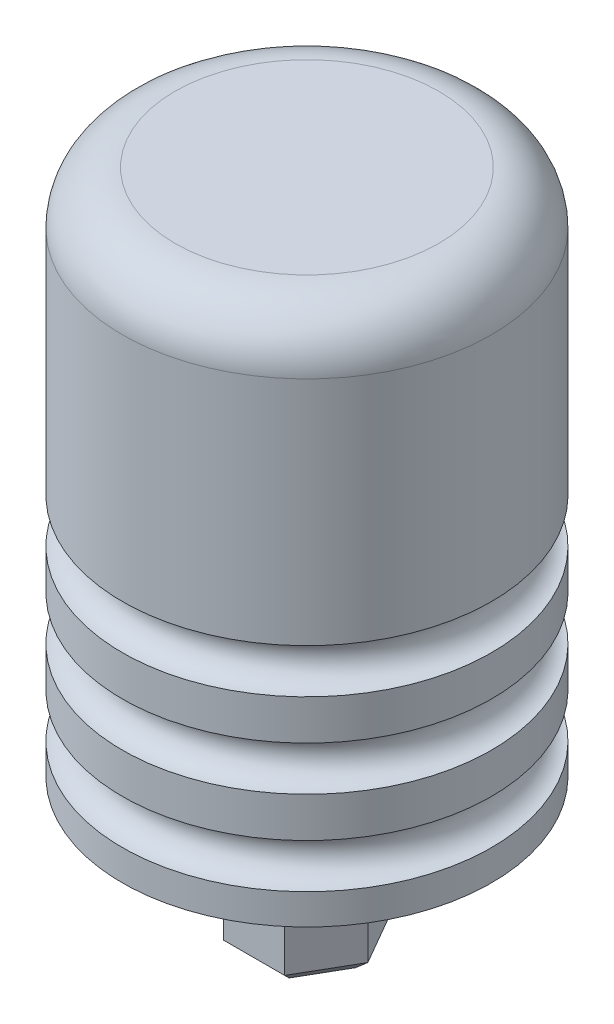
ISO-10303-21;
HEADER;
FILE_DESCRIPTION(('STEP AP214'),'2;1');
FILE_NAME('part.step','',(''),(''),'','','');
FILE_SCHEMA(('AUTOMOTIVE_DESIGN { 1 0 10303 214 1 1 1 1 }'));
ENDSEC;
DATA;
#1=APPLICATION_CONTEXT('core data for automotive mechanical design processes');
#2=APPLICATION_PROTOCOL_DEFINITION('international standard','automotive_design',2000,#1);
#3=PRODUCT_CONTEXT('',#1,'mechanical');
#4=PRODUCT('Part','Part','',(#3));
#5=PRODUCT_RELATED_PRODUCT_CATEGORY('part','',(#4));
#6=PRODUCT_DEFINITION_FORMATION('','',#4);
#7=PRODUCT_DEFINITION_CONTEXT('part definition',#1,'design');
#8=PRODUCT_DEFINITION('design','',#6,#7);
#9=PRODUCT_DEFINITION_SHAPE('','',#8);
#10=(LENGTH_UNIT() NAMED_UNIT(*) SI_UNIT(.MILLI.,.METRE.));
#11=(NAMED_UNIT(*) PLANE_ANGLE_UNIT() SI_UNIT($,.RADIAN.));
#12=(NAMED_UNIT(*) SI_UNIT($,.STERADIAN.) SOLID_ANGLE_UNIT());
#13=UNCERTAINTY_MEASURE_WITH_UNIT(LENGTH_MEASURE(1.E-05),#10,'distance_accuracy_value','');
#14=(GEOMETRIC_REPRESENTATION_CONTEXT(3) GLOBAL_UNCERTAINTY_ASSIGNED_CONTEXT((#13)) GLOBAL_UNIT_ASSIGNED_CONTEXT((#10,
#11,#12)) REPRESENTATION_CONTEXT('',''));
#15=CARTESIAN_POINT('',(0.,0.,0.));
#16=DIRECTION('',(0.,0.,1.));
#17=DIRECTION('',(1.,0.,0.));
#18=AXIS2_PLACEMENT_3D('',#15,#16,#17);
#19=CARTESIAN_POINT('',(22.225,0.,0.));
#20=DIRECTION('',(0.,-1.,0.));
#21=DIRECTION('',(0.,0.,-1.));
#22=AXIS2_PLACEMENT_3D('',#19,#20,#21);
#23=PLANE('',#22);
#24=DIRECTION('',(0.5,0.,0.866025403784439));
#25=VECTOR('',#24,1.);
#26=CARTESIAN_POINT('',(14.3550681024499,0.,4.54370729955457));
#27=LINE('',#26,#25);
#28=CARTESIAN_POINT('',(11.7317574699332,0.,0.));
#29=VERTEX_POINT('',#28);
#30=CARTESIAN_POINT('',(5.8658787349666,0.,-10.16));
#31=VERTEX_POINT('',#30);
#32=EDGE_CURVE('E172',#29,#31,#27,.F.);
#33=ORIENTED_EDGE('',*,*,#32,.T.);
#34=DIRECTION('',(1.,0.,0.));
#35=VECTOR('',#34,1.);
#36=CARTESIAN_POINT('',(22.225,0.,-10.16));
#37=LINE('',#36,#35);
#38=CARTESIAN_POINT('',(-5.86587873496659,0.,-10.16));
#39=VERTEX_POINT('',#38);
#40=EDGE_CURVE('E154',#31,#39,#37,.F.);
#41=ORIENTED_EDGE('',*,*,#40,.T.);
#42=DIRECTION('',(0.5,0.,-0.866025403784439));
#43=VECTOR('',#42,1.);
#44=CARTESIAN_POINT('',(-3.24256810244988,0.,-14.7037072995546));
#45=LINE('',#44,#43);
#46=CARTESIAN_POINT('',(-11.7317574699332,0.,0.));
#47=VERTEX_POINT('',#46);
#48=EDGE_CURVE('E192',#39,#47,#45,.F.);
#49=ORIENTED_EDGE('',*,*,#48,.T.);
#50=DIRECTION('',(-0.5,0.,-0.866025403784439));
#51=VECTOR('',#50,1.);
#52=CARTESIAN_POINT('',(-3.24256810244991,0.,14.7037072995546));
#53=LINE('',#52,#51);
#54=CARTESIAN_POINT('',(-5.86587873496659,0.,10.16));
#55=VERTEX_POINT('',#54);
#56=EDGE_CURVE('E189',#47,#55,#53,.F.);
#57=ORIENTED_EDGE('',*,*,#56,.T.);
#58=DIRECTION('',(-1.,0.,0.));
#59=VECTOR('',#58,1.);
#60=CARTESIAN_POINT('',(22.225,0.,10.16));
#61=LINE('',#60,#59);
#62=CARTESIAN_POINT('',(5.8658787349666,0.,10.16));
#63=VERTEX_POINT('',#62);
#64=EDGE_CURVE('E186',#55,#63,#61,.F.);
#65=ORIENTED_EDGE('',*,*,#64,.T.);
#66=DIRECTION('',(-0.5,0.,0.866025403784439));
#67=VECTOR('',#66,1.);
#68=CARTESIAN_POINT('',(14.3550681024499,0.,-4.54370729955457));
#69=LINE('',#68,#67);
#70=EDGE_CURVE('E177',#63,#29,#69,.F.);
#71=ORIENTED_EDGE('',*,*,#70,.T.);
#72=EDGE_LOOP('',(#33,#41,#49,#57,#65,#71));
#73=FACE_BOUND('',#72,.T.);
#74=CARTESIAN_POINT('',(0.,0.,0.));
#75=DIRECTION('',(0.,-1.,0.));
#76=DIRECTION('',(0.,0.,-1.));
#77=AXIS2_PLACEMENT_3D('',#74,#75,#76);
#78=CIRCLE('',#77,22.225);
#79=CARTESIAN_POINT('',(0.,0.,-22.225));
#80=VERTEX_POINT('',#79);
#81=EDGE_CURVE('E297',#80,#80,#78,.T.);
#82=ORIENTED_EDGE('',*,*,#81,.T.);
#83=EDGE_LOOP('',(#82));
#84=FACE_BOUND('',#83,.T.);
#85=ADVANCED_FACE('F39',(#73,#84),#23,.T.);
#86=CARTESIAN_POINT('',(0.,63.5,0.));
#87=DIRECTION('',(0.,1.,0.));
#88=DIRECTION('',(0.,0.,1.));
#89=AXIS2_PLACEMENT_3D('',#86,#87,#88);
#90=PLANE('',#89);
#91=CARTESIAN_POINT('',(0.,63.5,0.));
#92=DIRECTION('',(0.,-1.,0.));
#93=DIRECTION('',(0.,0.,-1.));
#94=AXIS2_PLACEMENT_3D('',#91,#92,#93);
#95=CIRCLE('',#94,15.875);
#96=CARTESIAN_POINT('',(0.,63.5,-15.875));
#97=VERTEX_POINT('',#96);
#98=EDGE_CURVE('E173',#97,#97,#95,.T.);
#99=ORIENTED_EDGE('',*,*,#98,.F.);
#100=EDGE_LOOP('',(#99));
#101=FACE_BOUND('',#100,.T.);
#102=ADVANCED_FACE('F357',(#101),#90,.T.);
#103=CARTESIAN_POINT('',(0.,57.15,0.));
#104=DIRECTION('',(0.,-1.,0.));
#105=DIRECTION('',(0.,0.,-1.));
#106=AXIS2_PLACEMENT_3D('',#103,#104,#105);
#107=TOROIDAL_SURFACE('',#106,15.875,6.35);
#108=ORIENTED_EDGE('',*,*,#98,.T.);
#109=EDGE_LOOP('',(#108));
#110=FACE_BOUND('',#109,.T.);
#111=CARTESIAN_POINT('',(0.,57.15,0.));
#112=DIRECTION('',(0.,-1.,0.));
#113=DIRECTION('',(0.,0.,-1.));
#114=AXIS2_PLACEMENT_3D('',#111,#112,#113);
#115=CIRCLE('',#114,22.225);
#116=CARTESIAN_POINT('',(0.,57.15,-22.225));
#117=VERTEX_POINT('',#116);
#118=EDGE_CURVE('E180',#117,#117,#115,.T.);
#119=ORIENTED_EDGE('',*,*,#118,.F.);
#120=EDGE_LOOP('',(#119));
#121=FACE_BOUND('',#120,.T.);
#122=ADVANCED_FACE('F355',(#110,#121),#107,.T.);
#123=CARTESIAN_POINT('',(0.,0.,0.));
#124=DIRECTION('',(0.,-1.,0.));
#125=DIRECTION('',(0.,0.,-1.));
#126=AXIS2_PLACEMENT_3D('',#123,#124,#125);
#127=CYLINDRICAL_SURFACE('',#126,22.225);
#128=ORIENTED_EDGE('',*,*,#118,.T.);
#129=EDGE_LOOP('',(#128));
#130=FACE_BOUND('',#129,.T.);
#131=CARTESIAN_POINT('',(0.,29.337,0.));
#132=DIRECTION('',(0.,-1.,0.));
#133=DIRECTION('',(0.,0.,-1.));
#134=AXIS2_PLACEMENT_3D('',#131,#132,#133);
#135=CIRCLE('',#134,22.225);
#136=CARTESIAN_POINT('',(0.,29.337,-22.225));
#137=VERTEX_POINT('',#136);
#138=EDGE_CURVE('E345',#137,#137,#135,.T.);
#139=ORIENTED_EDGE('',*,*,#138,.F.);
#140=EDGE_LOOP('',(#139));
#141=FACE_BOUND('',#140,.T.);
#142=ADVANCED_FACE('F352',(#130,#141),#127,.T.);
#143=CARTESIAN_POINT('',(0.,26.67,0.));
#144=DIRECTION('',(0.,-1.,0.));
#145=DIRECTION('',(0.,0.,-1.));
#146=AXIS2_PLACEMENT_3D('',#143,#144,#145);
#147=TOROIDAL_SURFACE('',#146,22.225,2.667);
#148=ORIENTED_EDGE('',*,*,#138,.T.);
#149=EDGE_LOOP('',(#148));
#150=FACE_BOUND('',#149,.T.);
#151=CARTESIAN_POINT('',(0.,24.003,0.));
#152=DIRECTION('',(0.,-1.,0.));
#153=DIRECTION('',(0.,0.,-1.));
#154=AXIS2_PLACEMENT_3D('',#151,#152,#153);
#155=CIRCLE('',#154,22.225);
#156=CARTESIAN_POINT('',(0.,24.003,-22.225));
#157=VERTEX_POINT('',#156);
#158=EDGE_CURVE('E341',#157,#157,#155,.T.);
#159=ORIENTED_EDGE('',*,*,#158,.F.);
#160=EDGE_LOOP('',(#159));
#161=FACE_BOUND('',#160,.T.);
#162=ADVANCED_FACE('F364',(#150,#161),#147,.F.);
#163=CARTESIAN_POINT('',(0.,0.,0.));
#164=DIRECTION('',(0.,-1.,0.));
#165=DIRECTION('',(0.,0.,-1.));
#166=AXIS2_PLACEMENT_3D('',#163,#164,#165);
#167=CYLINDRICAL_SURFACE('',#166,22.225);
#168=ORIENTED_EDGE('',*,*,#158,.T.);
#169=EDGE_LOOP('',(#168));
#170=FACE_BOUND('',#169,.T.);
#171=CARTESIAN_POINT('',(0.,19.177,0.));
#172=DIRECTION('',(0.,-1.,0.));
#173=DIRECTION('',(0.,0.,-1.));
#174=AXIS2_PLACEMENT_3D('',#171,#172,#173);
#175=CIRCLE('',#174,22.225);
#176=CARTESIAN_POINT('',(0.,19.177,-22.225));
#177=VERTEX_POINT('',#176);
#178=EDGE_CURVE('E337',#177,#177,#175,.T.);
#179=ORIENTED_EDGE('',*,*,#178,.F.);
#180=EDGE_LOOP('',(#179));
#181=FACE_BOUND('',#180,.T.);
#182=ADVANCED_FACE('F509',(#170,#181),#167,.T.);
#183=CARTESIAN_POINT('',(0.,16.51,0.));
#184=DIRECTION('',(0.,-1.,0.));
#185=DIRECTION('',(0.,0.,-1.));
#186=AXIS2_PLACEMENT_3D('',#183,#184,#185);
#187=TOROIDAL_SURFACE('',#186,22.225,2.667);
#188=ORIENTED_EDGE('',*,*,#178,.T.);
#189=EDGE_LOOP('',(#188));
#190=FACE_BOUND('',#189,.T.);
#191=CARTESIAN_POINT('',(0.,13.843,0.));
#192=DIRECTION('',(0.,-1.,0.));
#193=DIRECTION('',(0.,0.,-1.));
#194=AXIS2_PLACEMENT_3D('',#191,#192,#193);
#195=CIRCLE('',#194,22.225);
#196=CARTESIAN_POINT('',(0.,13.843,-22.225));
#197=VERTEX_POINT('',#196);
#198=EDGE_CURVE('E333',#197,#197,#195,.T.);
#199=ORIENTED_EDGE('',*,*,#198,.F.);
#200=EDGE_LOOP('',(#199));
#201=FACE_BOUND('',#200,.T.);
#202=ADVANCED_FACE('F501',(#190,#201),#187,.F.);
#203=CARTESIAN_POINT('',(0.,0.,0.));
#204=DIRECTION('',(0.,-1.,0.));
#205=DIRECTION('',(0.,0.,-1.));
#206=AXIS2_PLACEMENT_3D('',#203,#204,#205);
#207=CYLINDRICAL_SURFACE('',#206,22.225);
#208=ORIENTED_EDGE('',*,*,#198,.T.);
#209=EDGE_LOOP('',(#208));
#210=FACE_BOUND('',#209,.T.);
#211=CARTESIAN_POINT('',(0.,9.017,0.));
#212=DIRECTION('',(0.,-1.,0.));
#213=DIRECTION('',(0.,0.,-1.));
#214=AXIS2_PLACEMENT_3D('',#211,#212,#213);
#215=CIRCLE('',#214,22.225);
#216=CARTESIAN_POINT('',(0.,9.017,-22.225));
#217=VERTEX_POINT('',#216);
#218=EDGE_CURVE('E329',#217,#217,#215,.T.);
#219=ORIENTED_EDGE('',*,*,#218,.F.);
#220=EDGE_LOOP('',(#219));
#221=FACE_BOUND('',#220,.T.);
#222=ADVANCED_FACE('F493',(#210,#221),#207,.T.);
#223=CARTESIAN_POINT('',(0.,6.35,0.));
#224=DIRECTION('',(0.,-1.,0.));
#225=DIRECTION('',(0.,0.,-1.));
#226=AXIS2_PLACEMENT_3D('',#223,#224,#225);
#227=TOROIDAL_SURFACE('',#226,22.225,2.667);
#228=ORIENTED_EDGE('',*,*,#218,.T.);
#229=EDGE_LOOP('',(#228));
#230=FACE_BOUND('',#229,.T.);
#231=CARTESIAN_POINT('',(0.,3.683,0.));
#232=DIRECTION('',(0.,-1.,0.));
#233=DIRECTION('',(0.,0.,-1.));
#234=AXIS2_PLACEMENT_3D('',#231,#232,#233);
#235=CIRCLE('',#234,22.225);
#236=CARTESIAN_POINT('',(0.,3.683,-22.225));
#237=VERTEX_POINT('',#236);
#238=EDGE_CURVE('E325',#237,#237,#235,.T.);
#239=ORIENTED_EDGE('',*,*,#238,.F.);
#240=EDGE_LOOP('',(#239));
#241=FACE_BOUND('',#240,.T.);
#242=ADVANCED_FACE('F485',(#230,#241),#227,.F.);
#243=CARTESIAN_POINT('',(0.,0.,0.));
#244=DIRECTION('',(0.,-1.,0.));
#245=DIRECTION('',(0.,0.,-1.));
#246=AXIS2_PLACEMENT_3D('',#243,#244,#245);
#247=CYLINDRICAL_SURFACE('',#246,22.225);
#248=ORIENTED_EDGE('',*,*,#238,.T.);
#249=EDGE_LOOP('',(#248));
#250=FACE_BOUND('',#249,.T.);
#251=ORIENTED_EDGE('',*,*,#81,.F.);
#252=EDGE_LOOP('',(#251));
#253=FACE_BOUND('',#252,.T.);
#254=ADVANCED_FACE('F478',(#250,#253),#247,.T.);
#255=CARTESIAN_POINT('',(3.66617420935413,-17.018,-6.35000000000001));
#256=DIRECTION('',(-0.866025403784439,0.,0.5));
#257=DIRECTION('',(0.5,0.,0.866025403784439));
#258=AXIS2_PLACEMENT_3D('',#255,#256,#257);
#259=PLANE('',#258);
#260=DIRECTION('',(0.,1.,0.));
#261=VECTOR('',#260,1.);
#262=CARTESIAN_POINT('',(7.33234841870825,-17.018,0.));
#263=LINE('',#262,#261);
#264=CARTESIAN_POINT('',(7.33234841870825,-15.748,0.));
#265=VERTEX_POINT('',#264);
#266=CARTESIAN_POINT('',(7.33234841870825,-3.81,0.));
#267=VERTEX_POINT('',#266);
#268=EDGE_CURVE('E294',#265,#267,#263,.T.);
#269=ORIENTED_EDGE('',*,*,#268,.F.);
#270=DIRECTION('',(-0.5,0.,-0.866025403784439));
#271=VECTOR('',#270,1.);
#272=CARTESIAN_POINT('',(3.66617420935413,-15.748,-6.35000000000001));
#273=LINE('',#272,#271);
#274=CARTESIAN_POINT('',(3.66617420935413,-15.748,-6.35000000000001));
#275=VERTEX_POINT('',#274);
#276=EDGE_CURVE('E139',#265,#275,#273,.T.);
#277=ORIENTED_EDGE('',*,*,#276,.T.);
#278=DIRECTION('',(0.,1.,0.));
#279=VECTOR('',#278,1.);
#280=CARTESIAN_POINT('',(3.66617420935413,-17.018,-6.35000000000001));
#281=LINE('',#280,#279);
#282=CARTESIAN_POINT('',(3.66617420935413,-3.81,-6.35000000000001));
#283=VERTEX_POINT('',#282);
#284=EDGE_CURVE('E131',#275,#283,#281,.T.);
#285=ORIENTED_EDGE('',*,*,#284,.T.);
#286=DIRECTION('',(0.5,0.,0.866025403784439));
#287=VECTOR('',#286,1.);
#288=CARTESIAN_POINT('',(3.66617420935413,-3.81,-6.35000000000001));
#289=LINE('',#288,#287);
#290=EDGE_CURVE('E136',#283,#267,#289,.T.);
#291=ORIENTED_EDGE('',*,*,#290,.T.);
#292=EDGE_LOOP('',(#269,#277,#285,#291));
#293=FACE_BOUND('',#292,.T.);
#294=ADVANCED_FACE('F134',(#293),#259,.F.);
#295=CARTESIAN_POINT('',(7.33234841870825,-17.018,0.));
#296=DIRECTION('',(-0.866025403784439,0.,-0.5));
#297=DIRECTION('',(-0.5,0.,0.866025403784439));
#298=AXIS2_PLACEMENT_3D('',#295,#296,#297);
#299=PLANE('',#298);
#300=DIRECTION('',(0.,1.,0.));
#301=VECTOR('',#300,1.);
#302=CARTESIAN_POINT('',(3.66617420935413,-17.018,6.35));
#303=LINE('',#302,#301);
#304=CARTESIAN_POINT('',(3.66617420935413,-15.748,6.35));
#305=VERTEX_POINT('',#304);
#306=CARTESIAN_POINT('',(3.66617420935413,-3.81,6.35));
#307=VERTEX_POINT('',#306);
#308=EDGE_CURVE('E295',#305,#307,#303,.T.);
#309=ORIENTED_EDGE('',*,*,#308,.F.);
#310=DIRECTION('',(0.5,0.,-0.866025403784439));
#311=VECTOR('',#310,1.);
#312=CARTESIAN_POINT('',(7.33234841870825,-15.748,0.));
#313=LINE('',#312,#311);
#314=EDGE_CURVE('E11',#305,#265,#313,.T.);
#315=ORIENTED_EDGE('',*,*,#314,.T.);
#316=ORIENTED_EDGE('',*,*,#268,.T.);
#317=DIRECTION('',(-0.5,0.,0.866025403784439));
#318=VECTOR('',#317,1.);
#319=CARTESIAN_POINT('',(7.33234841870825,-3.81,0.));
#320=LINE('',#319,#318);
#321=EDGE_CURVE('E166',#267,#307,#320,.T.);
#322=ORIENTED_EDGE('',*,*,#321,.T.);
#323=EDGE_LOOP('',(#309,#315,#316,#322));
#324=FACE_BOUND('',#323,.T.);
#325=ADVANCED_FACE('F293',(#324),#299,.F.);
#326=CARTESIAN_POINT('',(3.66617420935413,-17.018,6.35));
#327=DIRECTION('',(0.,0.,-1.));
#328=DIRECTION('',(-1.,0.,0.));
#329=AXIS2_PLACEMENT_3D('',#326,#327,#328);
#330=PLANE('',#329);
#331=DIRECTION('',(0.,1.,0.));
#332=VECTOR('',#331,1.);
#333=CARTESIAN_POINT('',(-3.66617420935412,-17.018,6.35));
#334=LINE('',#333,#332);
#335=CARTESIAN_POINT('',(-3.66617420935412,-15.748,6.35));
#336=VERTEX_POINT('',#335);
#337=CARTESIAN_POINT('',(-3.66617420935412,-3.81,6.35));
#338=VERTEX_POINT('',#337);
#339=EDGE_CURVE('E315',#336,#338,#334,.T.);
#340=ORIENTED_EDGE('',*,*,#339,.F.);
#341=DIRECTION('',(1.,0.,0.));
#342=VECTOR('',#341,1.);
#343=CARTESIAN_POINT('',(3.66617420935413,-15.748,6.35));
#344=LINE('',#343,#342);
#345=EDGE_CURVE('E49',#336,#305,#344,.T.);
#346=ORIENTED_EDGE('',*,*,#345,.T.);
#347=ORIENTED_EDGE('',*,*,#308,.T.);
#348=DIRECTION('',(-1.,0.,0.));
#349=VECTOR('',#348,1.);
#350=CARTESIAN_POINT('',(3.66617420935413,-3.81,6.35));
#351=LINE('',#350,#349);
#352=EDGE_CURVE('E204',#307,#338,#351,.T.);
#353=ORIENTED_EDGE('',*,*,#352,.T.);
#354=EDGE_LOOP('',(#340,#346,#347,#353));
#355=FACE_BOUND('',#354,.T.);
#356=ADVANCED_FACE('F460',(#355),#330,.F.);
#357=CARTESIAN_POINT('',(-3.66617420935412,-17.018,6.35));
#358=DIRECTION('',(0.866025403784439,0.,-0.5));
#359=DIRECTION('',(-0.5,0.,-0.866025403784439));
#360=AXIS2_PLACEMENT_3D('',#357,#358,#359);
#361=PLANE('',#360);
#362=DIRECTION('',(0.,1.,0.));
#363=VECTOR('',#362,1.);
#364=CARTESIAN_POINT('',(-7.33234841870824,-17.018,0.));
#365=LINE('',#364,#363);
#366=CARTESIAN_POINT('',(-7.33234841870824,-15.748,0.));
#367=VERTEX_POINT('',#366);
#368=CARTESIAN_POINT('',(-7.33234841870824,-3.81,0.));
#369=VERTEX_POINT('',#368);
#370=EDGE_CURVE('E312',#367,#369,#365,.T.);
#371=ORIENTED_EDGE('',*,*,#370,.F.);
#372=DIRECTION('',(0.5,0.,0.866025403784439));
#373=VECTOR('',#372,1.);
#374=CARTESIAN_POINT('',(-3.66617420935412,-15.748,6.35));
#375=LINE('',#374,#373);
#376=EDGE_CURVE('E64',#367,#336,#375,.T.);
#377=ORIENTED_EDGE('',*,*,#376,.T.);
#378=ORIENTED_EDGE('',*,*,#339,.T.);
#379=DIRECTION('',(-0.5,0.,-0.866025403784439));
#380=VECTOR('',#379,1.);
#381=CARTESIAN_POINT('',(-3.66617420935412,-3.81,6.35));
#382=LINE('',#381,#380);
#383=EDGE_CURVE('E200',#338,#369,#382,.T.);
#384=ORIENTED_EDGE('',*,*,#383,.T.);
#385=EDGE_LOOP('',(#371,#377,#378,#384));
#386=FACE_BOUND('',#385,.T.);
#387=ADVANCED_FACE('F453',(#386),#361,.F.);
#388=CARTESIAN_POINT('',(-7.33234841870824,-17.018,0.));
#389=DIRECTION('',(0.866025403784439,0.,0.5));
#390=DIRECTION('',(0.5,0.,-0.866025403784439));
#391=AXIS2_PLACEMENT_3D('',#388,#389,#390);
#392=PLANE('',#391);
#393=DIRECTION('',(0.,1.,0.));
#394=VECTOR('',#393,1.);
#395=CARTESIAN_POINT('',(-3.66617420935411,-17.018,-6.35000000000001));
#396=LINE('',#395,#394);
#397=CARTESIAN_POINT('',(-3.66617420935411,-15.748,-6.35000000000001));
#398=VERTEX_POINT('',#397);
#399=CARTESIAN_POINT('',(-3.66617420935411,-3.81,-6.35000000000001));
#400=VERTEX_POINT('',#399);
#401=EDGE_CURVE('E143',#398,#400,#396,.T.);
#402=ORIENTED_EDGE('',*,*,#401,.F.);
#403=DIRECTION('',(-0.5,0.,0.866025403784439));
#404=VECTOR('',#403,1.);
#405=CARTESIAN_POINT('',(-7.33234841870824,-15.748,0.));
#406=LINE('',#405,#404);
#407=EDGE_CURVE('E249',#398,#367,#406,.T.);
#408=ORIENTED_EDGE('',*,*,#407,.T.);
#409=ORIENTED_EDGE('',*,*,#370,.T.);
#410=DIRECTION('',(0.5,0.,-0.866025403784439));
#411=VECTOR('',#410,1.);
#412=CARTESIAN_POINT('',(-7.33234841870824,-3.81,0.));
#413=LINE('',#412,#411);
#414=EDGE_CURVE('E197',#369,#400,#413,.T.);
#415=ORIENTED_EDGE('',*,*,#414,.T.);
#416=EDGE_LOOP('',(#402,#408,#409,#415));
#417=FACE_BOUND('',#416,.T.);
#418=ADVANCED_FACE('F308',(#417),#392,.F.);
#419=CARTESIAN_POINT('',(-3.66617420935411,-17.018,-6.35000000000001));
#420=DIRECTION('',(0.,0.,1.));
#421=DIRECTION('',(1.,0.,0.));
#422=AXIS2_PLACEMENT_3D('',#419,#420,#421);
#423=PLANE('',#422);
#424=ORIENTED_EDGE('',*,*,#284,.F.);
#425=DIRECTION('',(-1.,0.,0.));
#426=VECTOR('',#425,1.);
#427=CARTESIAN_POINT('',(-3.66617420935411,-15.748,-6.35000000000001));
#428=LINE('',#427,#426);
#429=EDGE_CURVE('E246',#275,#398,#428,.T.);
#430=ORIENTED_EDGE('',*,*,#429,.T.);
#431=ORIENTED_EDGE('',*,*,#401,.T.);
#432=DIRECTION('',(1.,0.,0.));
#433=VECTOR('',#432,1.);
#434=CARTESIAN_POINT('',(-3.66617420935411,-3.81,-6.35000000000001));
#435=LINE('',#434,#433);
#436=EDGE_CURVE('E152',#400,#283,#435,.T.);
#437=ORIENTED_EDGE('',*,*,#436,.T.);
#438=EDGE_LOOP('',(#424,#430,#431,#437));
#439=FACE_BOUND('',#438,.T.);
#440=ADVANCED_FACE('F168',(#439),#423,.F.);
#441=CARTESIAN_POINT('',(0.,-17.018,0.));
#442=DIRECTION('',(0.,-1.,0.));
#443=DIRECTION('',(0.,0.,-1.));
#444=AXIS2_PLACEMENT_3D('',#441,#442,#443);
#445=PLANE('',#444);
#446=DIRECTION('',(1.,0.,0.));
#447=VECTOR('',#446,1.);
#448=CARTESIAN_POINT('',(3.66617420935413,-17.018,-5.08));
#449=LINE('',#448,#447);
#450=CARTESIAN_POINT('',(-2.93293936748328,-17.018,-5.08));
#451=VERTEX_POINT('',#450);
#452=CARTESIAN_POINT('',(2.9329393674833,-17.018,-5.08));
#453=VERTEX_POINT('',#452);
#454=EDGE_CURVE('E237',#451,#453,#449,.T.);
#455=ORIENTED_EDGE('',*,*,#454,.T.);
#456=DIRECTION('',(0.5,0.,0.866025403784439));
#457=VECTOR('',#456,1.);
#458=CARTESIAN_POINT('',(6.23249615590201,-17.018,0.635000000000004));
#459=LINE('',#458,#457);
#460=CARTESIAN_POINT('',(5.86587873496659,-17.018,0.));
#461=VERTEX_POINT('',#460);
#462=EDGE_CURVE('E240',#453,#461,#459,.T.);
#463=ORIENTED_EDGE('',*,*,#462,.T.);
#464=DIRECTION('',(-0.5,0.,0.866025403784439));
#465=VECTOR('',#464,1.);
#466=CARTESIAN_POINT('',(2.56632194654788,-17.018,5.715));
#467=LINE('',#466,#465);
#468=CARTESIAN_POINT('',(2.9329393674833,-17.018,5.08));
#469=VERTEX_POINT('',#468);
#470=EDGE_CURVE('E165',#461,#469,#467,.T.);
#471=ORIENTED_EDGE('',*,*,#470,.T.);
#472=DIRECTION('',(-1.,0.,0.));
#473=VECTOR('',#472,1.);
#474=CARTESIAN_POINT('',(-3.66617420935412,-17.018,5.08));
#475=LINE('',#474,#473);
#476=CARTESIAN_POINT('',(-2.93293936748329,-17.018,5.08));
#477=VERTEX_POINT('',#476);
#478=EDGE_CURVE('E228',#469,#477,#475,.T.);
#479=ORIENTED_EDGE('',*,*,#478,.T.);
#480=DIRECTION('',(-0.5,0.,-0.866025403784439));
#481=VECTOR('',#480,1.);
#482=CARTESIAN_POINT('',(-6.232496155902,-17.018,-0.635000000000005));
#483=LINE('',#482,#481);
#484=CARTESIAN_POINT('',(-5.86587873496658,-17.018,0.));
#485=VERTEX_POINT('',#484);
#486=EDGE_CURVE('E231',#477,#485,#483,.T.);
#487=ORIENTED_EDGE('',*,*,#486,.T.);
#488=DIRECTION('',(0.5,0.,-0.866025403784439));
#489=VECTOR('',#488,1.);
#490=CARTESIAN_POINT('',(-2.56632194654787,-17.018,-5.715));
#491=LINE('',#490,#489);
#492=EDGE_CURVE('E234',#485,#451,#491,.T.);
#493=ORIENTED_EDGE('',*,*,#492,.T.);
#494=EDGE_LOOP('',(#455,#463,#471,#479,#487,#493));
#495=FACE_BOUND('',#494,.T.);
#496=ADVANCED_FACE('F394',(#495),#445,.T.);
#497=CARTESIAN_POINT('',(3.66617420935413,-3.81,10.16));
#498=DIRECTION('',(-1.,0.,0.));
#499=DIRECTION('',(0.,0.,1.));
#500=AXIS2_PLACEMENT_3D('',#497,#498,#499);
#501=CYLINDRICAL_SURFACE('',#500,3.81);
#502=CARTESIAN_POINT('',(5.8658787349666,-3.81,10.16));
#503=DIRECTION('',(-0.866025403784439,0.,0.5));
#504=DIRECTION('',(0.5,0.,0.866025403784439));
#505=AXIS2_PLACEMENT_3D('',#502,#503,#504);
#506=ELLIPSE('',#505,4.39940905122495,3.81);
#507=EDGE_CURVE('E219',#63,#307,#506,.T.);
#508=ORIENTED_EDGE('',*,*,#507,.F.);
#509=ORIENTED_EDGE('',*,*,#64,.F.);
#510=CARTESIAN_POINT('',(-5.86587873496659,-3.81,10.16));
#511=DIRECTION('',(-0.866025403784438,0.,-0.5));
#512=DIRECTION('',(-0.5,0.,0.866025403784439));
#513=AXIS2_PLACEMENT_3D('',#510,#511,#512);
#514=ELLIPSE('',#513,4.39940905122495,3.81);
#515=EDGE_CURVE('E144',#338,#55,#514,.F.);
#516=ORIENTED_EDGE('',*,*,#515,.F.);
#517=ORIENTED_EDGE('',*,*,#352,.F.);
#518=EDGE_LOOP('',(#508,#509,#516,#517));
#519=FACE_BOUND('',#518,.T.);
#520=ADVANCED_FACE('F390',(#519),#501,.F.);
#521=CARTESIAN_POINT('',(-6.96573099777283,-3.81,8.255));
#522=DIRECTION('',(-0.5,0.,-0.866025403784439));
#523=DIRECTION('',(-0.866025403784439,0.,0.5));
#524=AXIS2_PLACEMENT_3D('',#521,#522,#523);
#525=CYLINDRICAL_SURFACE('',#524,3.81);
#526=ORIENTED_EDGE('',*,*,#515,.T.);
#527=ORIENTED_EDGE('',*,*,#56,.F.);
#528=CARTESIAN_POINT('',(-11.7317574699332,-3.81,0.));
#529=DIRECTION('',(0.,0.,-1.));
#530=DIRECTION('',(-1.,0.,0.));
#531=AXIS2_PLACEMENT_3D('',#528,#529,#530);
#532=ELLIPSE('',#531,4.39940905122495,3.81);
#533=EDGE_CURVE('E215',#369,#47,#532,.F.);
#534=ORIENTED_EDGE('',*,*,#533,.F.);
#535=ORIENTED_EDGE('',*,*,#383,.F.);
#536=EDGE_LOOP('',(#526,#527,#534,#535));
#537=FACE_BOUND('',#536,.T.);
#538=ADVANCED_FACE('F386',(#537),#525,.F.);
#539=CARTESIAN_POINT('',(10.631905207127,-3.81,1.905));
#540=DIRECTION('',(-0.5,0.,0.866025403784439));
#541=DIRECTION('',(0.866025403784439,0.,0.5));
#542=AXIS2_PLACEMENT_3D('',#539,#540,#541);
#543=CYLINDRICAL_SURFACE('',#542,3.81);
#544=ORIENTED_EDGE('',*,*,#507,.T.);
#545=ORIENTED_EDGE('',*,*,#321,.F.);
#546=CARTESIAN_POINT('',(11.7317574699332,-3.81,0.));
#547=DIRECTION('',(0.,0.,1.));
#548=DIRECTION('',(1.,0.,0.));
#549=AXIS2_PLACEMENT_3D('',#546,#547,#548);
#550=ELLIPSE('',#549,4.39940905122495,3.81);
#551=EDGE_CURVE('E163',#29,#267,#550,.T.);
#552=ORIENTED_EDGE('',*,*,#551,.F.);
#553=ORIENTED_EDGE('',*,*,#70,.F.);
#554=EDGE_LOOP('',(#544,#545,#552,#553));
#555=FACE_BOUND('',#554,.T.);
#556=ADVANCED_FACE('F382',(#555),#543,.F.);
#557=CARTESIAN_POINT('',(-10.631905207127,-3.81,-1.905));
#558=DIRECTION('',(0.5,0.,-0.866025403784439));
#559=DIRECTION('',(-0.866025403784439,0.,-0.5));
#560=AXIS2_PLACEMENT_3D('',#557,#558,#559);
#561=CYLINDRICAL_SURFACE('',#560,3.81);
#562=ORIENTED_EDGE('',*,*,#533,.T.);
#563=ORIENTED_EDGE('',*,*,#48,.F.);
#564=CARTESIAN_POINT('',(-5.86587873496658,-3.81,-10.16));
#565=DIRECTION('',(0.866025403784439,0.,-0.5));
#566=DIRECTION('',(-0.5,0.,-0.866025403784439));
#567=AXIS2_PLACEMENT_3D('',#564,#565,#566);
#568=ELLIPSE('',#567,4.39940905122495,3.81);
#569=EDGE_CURVE('E158',#400,#39,#568,.F.);
#570=ORIENTED_EDGE('',*,*,#569,.F.);
#571=ORIENTED_EDGE('',*,*,#414,.F.);
#572=EDGE_LOOP('',(#562,#563,#570,#571));
#573=FACE_BOUND('',#572,.T.);
#574=ADVANCED_FACE('F379',(#573),#561,.F.);
#575=CARTESIAN_POINT('',(6.96573099777284,-3.81,-8.25500000000001));
#576=DIRECTION('',(0.5,0.,0.866025403784439));
#577=DIRECTION('',(0.866025403784439,0.,-0.5));
#578=AXIS2_PLACEMENT_3D('',#575,#576,#577);
#579=CYLINDRICAL_SURFACE('',#578,3.81);
#580=ORIENTED_EDGE('',*,*,#551,.T.);
#581=ORIENTED_EDGE('',*,*,#290,.F.);
#582=CARTESIAN_POINT('',(5.8658787349666,-3.81,-10.16));
#583=DIRECTION('',(0.866025403784438,0.,0.5));
#584=DIRECTION('',(-0.5,0.,0.866025403784439));
#585=AXIS2_PLACEMENT_3D('',#582,#583,#584);
#586=ELLIPSE('',#585,4.39940905122495,3.81);
#587=EDGE_CURVE('E150',#31,#283,#586,.T.);
#588=ORIENTED_EDGE('',*,*,#587,.F.);
#589=ORIENTED_EDGE('',*,*,#32,.F.);
#590=EDGE_LOOP('',(#580,#581,#588,#589));
#591=FACE_BOUND('',#590,.T.);
#592=ADVANCED_FACE('F161',(#591),#579,.F.);
#593=CARTESIAN_POINT('',(-3.66617420935411,-3.81,-10.16));
#594=DIRECTION('',(1.,0.,0.));
#595=DIRECTION('',(0.,0.,-1.));
#596=AXIS2_PLACEMENT_3D('',#593,#594,#595);
#597=CYLINDRICAL_SURFACE('',#596,3.81);
#598=ORIENTED_EDGE('',*,*,#569,.T.);
#599=ORIENTED_EDGE('',*,*,#40,.F.);
#600=ORIENTED_EDGE('',*,*,#587,.T.);
#601=ORIENTED_EDGE('',*,*,#436,.F.);
#602=EDGE_LOOP('',(#598,#599,#600,#601));
#603=FACE_BOUND('',#602,.T.);
#604=ADVANCED_FACE('F151',(#603),#597,.F.);
#605=CARTESIAN_POINT('',(-4.39940905122494,-17.018,2.53999999999999));
#606=DIRECTION('',(-0.612372435695791,-0.707106781186551,0.353553390593272));
#607=DIRECTION('',(0.5,0.,0.866025403784439));
#608=AXIS2_PLACEMENT_3D('',#605,#606,#607);
#609=PLANE('',#608);
#610=DIRECTION('',(0.377964473009229,-0.654653670707973,-0.65465367070798));
#611=VECTOR('',#610,1.);
#612=CARTESIAN_POINT('',(-2.51394802927139,-17.7437142857143,4.35428571428571));
#613=LINE('',#612,#611);
#614=EDGE_CURVE('E269',#336,#477,#613,.T.);
#615=ORIENTED_EDGE('',*,*,#614,.F.);
#616=ORIENTED_EDGE('',*,*,#376,.F.);
#617=DIRECTION('',(0.755928946018458,-0.654653670707973,0.));
#618=VECTOR('',#617,1.);
#619=CARTESIAN_POINT('',(-5.02789605854278,-17.7437142857143,0.));
#620=LINE('',#619,#618);
#621=EDGE_CURVE('E43',#485,#367,#620,.F.);
#622=ORIENTED_EDGE('',*,*,#621,.F.);
#623=ORIENTED_EDGE('',*,*,#486,.F.);
#624=EDGE_LOOP('',(#615,#616,#622,#623));
#625=FACE_BOUND('',#624,.T.);
#626=ADVANCED_FACE('F41',(#625),#609,.T.);
#627=CARTESIAN_POINT('',(-4.39940905122494,-17.018,-2.53999999999999));
#628=DIRECTION('',(-0.612372435695791,-0.707106781186551,-0.353553390593272));
#629=DIRECTION('',(-0.5,0.,0.866025403784439));
#630=AXIS2_PLACEMENT_3D('',#627,#628,#629);
#631=PLANE('',#630);
#632=ORIENTED_EDGE('',*,*,#621,.T.);
#633=ORIENTED_EDGE('',*,*,#407,.F.);
#634=DIRECTION('',(0.377964473009229,-0.654653670707973,0.65465367070798));
#635=VECTOR('',#634,1.);
#636=CARTESIAN_POINT('',(-2.51394802927138,-17.7437142857143,-4.35428571428571));
#637=LINE('',#636,#635);
#638=EDGE_CURVE('E266',#451,#398,#637,.F.);
#639=ORIENTED_EDGE('',*,*,#638,.F.);
#640=ORIENTED_EDGE('',*,*,#492,.F.);
#641=EDGE_LOOP('',(#632,#633,#639,#640));
#642=FACE_BOUND('',#641,.T.);
#643=ADVANCED_FACE('F281',(#642),#631,.T.);
#644=CARTESIAN_POINT('',(0.,-17.018,5.08));
#645=DIRECTION('',(0.,-0.707106781186551,0.707106781186544));
#646=DIRECTION('',(1.,0.,0.));
#647=AXIS2_PLACEMENT_3D('',#644,#645,#646);
#648=PLANE('',#647);
#649=ORIENTED_EDGE('',*,*,#614,.T.);
#650=ORIENTED_EDGE('',*,*,#478,.F.);
#651=DIRECTION('',(-0.37796447300923,-0.654653670707973,-0.65465367070798));
#652=VECTOR('',#651,1.);
#653=CARTESIAN_POINT('',(2.51394802927139,-17.7437142857143,4.35428571428571));
#654=LINE('',#653,#652);
#655=EDGE_CURVE('E262',#305,#469,#654,.T.);
#656=ORIENTED_EDGE('',*,*,#655,.F.);
#657=ORIENTED_EDGE('',*,*,#345,.F.);
#658=EDGE_LOOP('',(#649,#650,#656,#657));
#659=FACE_BOUND('',#658,.T.);
#660=ADVANCED_FACE('F286',(#659),#648,.T.);
#661=CARTESIAN_POINT('',(0.,-17.018,-5.08));
#662=DIRECTION('',(0.,-0.707106781186551,-0.707106781186544));
#663=DIRECTION('',(-1.,0.,0.));
#664=AXIS2_PLACEMENT_3D('',#661,#662,#663);
#665=PLANE('',#664);
#666=ORIENTED_EDGE('',*,*,#638,.T.);
#667=ORIENTED_EDGE('',*,*,#429,.F.);
#668=DIRECTION('',(-0.377964473009229,-0.654653670707973,0.65465367070798));
#669=VECTOR('',#668,1.);
#670=CARTESIAN_POINT('',(2.51394802927139,-17.7437142857143,-4.35428571428571));
#671=LINE('',#670,#669);
#672=EDGE_CURVE('E259',#453,#275,#671,.F.);
#673=ORIENTED_EDGE('',*,*,#672,.F.);
#674=ORIENTED_EDGE('',*,*,#454,.F.);
#675=EDGE_LOOP('',(#666,#667,#673,#674));
#676=FACE_BOUND('',#675,.T.);
#677=ADVANCED_FACE('F306',(#676),#665,.T.);
#678=CARTESIAN_POINT('',(4.39940905122494,-17.018,2.54));
#679=DIRECTION('',(0.612372435695791,-0.707106781186551,0.353553390593272));
#680=DIRECTION('',(0.5,0.,-0.866025403784439));
#681=AXIS2_PLACEMENT_3D('',#678,#679,#680);
#682=PLANE('',#681);
#683=ORIENTED_EDGE('',*,*,#655,.T.);
#684=ORIENTED_EDGE('',*,*,#470,.F.);
#685=DIRECTION('',(0.755928946018458,0.654653670707973,0.));
#686=VECTOR('',#685,1.);
#687=CARTESIAN_POINT('',(5.02789605854279,-17.7437142857143,0.));
#688=LINE('',#687,#686);
#689=EDGE_CURVE('E256',#265,#461,#688,.F.);
#690=ORIENTED_EDGE('',*,*,#689,.F.);
#691=ORIENTED_EDGE('',*,*,#314,.F.);
#692=EDGE_LOOP('',(#683,#684,#690,#691));
#693=FACE_BOUND('',#692,.T.);
#694=ADVANCED_FACE('F291',(#693),#682,.T.);
#695=CARTESIAN_POINT('',(4.39940905122495,-17.018,-2.54));
#696=DIRECTION('',(0.612372435695791,-0.707106781186551,-0.353553390593272));
#697=DIRECTION('',(-0.5,0.,-0.866025403784439));
#698=AXIS2_PLACEMENT_3D('',#695,#696,#697);
#699=PLANE('',#698);
#700=ORIENTED_EDGE('',*,*,#672,.T.);
#701=ORIENTED_EDGE('',*,*,#276,.F.);
#702=ORIENTED_EDGE('',*,*,#689,.T.);
#703=ORIENTED_EDGE('',*,*,#462,.F.);
#704=EDGE_LOOP('',(#700,#701,#702,#703));
#705=FACE_BOUND('',#704,.T.);
#706=ADVANCED_FACE('F300',(#705),#699,.T.);
#707=CLOSED_SHELL('',(#85,#102,#122,#142,#162,#182,#202,#222,#242,#254,#294,#325,#356,#387,#418,
#440,#496,#520,#538,#556,#574,#592,#604,#626,#643,#660,#677,#694,#706));
#708=MANIFOLD_SOLID_BREP('B2',#707);
#709=ADVANCED_BREP_SHAPE_REPRESENTATION('',(#18,#708),#14);
#710=SHAPE_DEFINITION_REPRESENTATION(#9,#709);
ENDSEC;
END-ISO-10303-21;
